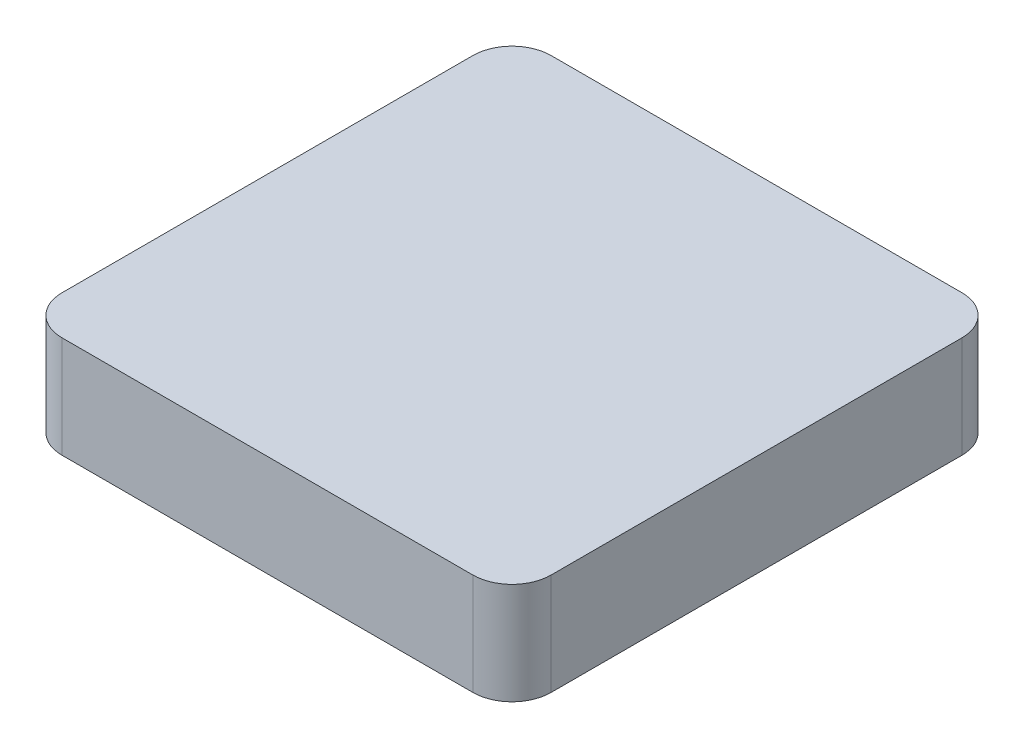
ISO-10303-21;
HEADER;
FILE_DESCRIPTION(('STEP AP214'),'2;1');
FILE_NAME('part.step','',(''),(''),'','','');
FILE_SCHEMA(('AUTOMOTIVE_DESIGN { 1 0 10303 214 1 1 1 1 }'));
ENDSEC;
DATA;
#1=APPLICATION_CONTEXT('core data for automotive mechanical design processes');
#2=APPLICATION_PROTOCOL_DEFINITION('international standard','automotive_design',2000,#1);
#3=PRODUCT_CONTEXT('',#1,'mechanical');
#4=PRODUCT('Part','Part','',(#3));
#5=PRODUCT_RELATED_PRODUCT_CATEGORY('part','',(#4));
#6=PRODUCT_DEFINITION_FORMATION('','',#4);
#7=PRODUCT_DEFINITION_CONTEXT('part definition',#1,'design');
#8=PRODUCT_DEFINITION('design','',#6,#7);
#9=PRODUCT_DEFINITION_SHAPE('','',#8);
#10=(LENGTH_UNIT() NAMED_UNIT(*) SI_UNIT(.MILLI.,.METRE.));
#11=(NAMED_UNIT(*) PLANE_ANGLE_UNIT() SI_UNIT($,.RADIAN.));
#12=(NAMED_UNIT(*) SI_UNIT($,.STERADIAN.) SOLID_ANGLE_UNIT());
#13=UNCERTAINTY_MEASURE_WITH_UNIT(LENGTH_MEASURE(1.E-05),#10,'distance_accuracy_value','');
#14=(GEOMETRIC_REPRESENTATION_CONTEXT(3) GLOBAL_UNCERTAINTY_ASSIGNED_CONTEXT((#13)) GLOBAL_UNIT_ASSIGNED_CONTEXT((#10,
#11,#12)) REPRESENTATION_CONTEXT('',''));
#15=CARTESIAN_POINT('',(0.,0.,0.));
#16=DIRECTION('',(0.,0.,1.));
#17=DIRECTION('',(1.,0.,0.));
#18=AXIS2_PLACEMENT_3D('',#15,#16,#17);
#19=CARTESIAN_POINT('',(12.5,5.2,12.5));
#20=DIRECTION('',(-1.,0.,0.));
#21=DIRECTION('',(0.,0.,1.));
#22=AXIS2_PLACEMENT_3D('',#19,#20,#21);
#23=PLANE('',#22);
#24=DIRECTION('',(0.,0.,-1.));
#25=VECTOR('',#24,1.);
#26=CARTESIAN_POINT('',(12.5,0.,12.5));
#27=LINE('',#26,#25);
#28=CARTESIAN_POINT('',(12.5,0.,10.5));
#29=VERTEX_POINT('',#28);
#30=CARTESIAN_POINT('',(12.5,0.,-10.5));
#31=VERTEX_POINT('',#30);
#32=EDGE_CURVE('E140',#29,#31,#27,.T.);
#33=ORIENTED_EDGE('',*,*,#32,.T.);
#34=DIRECTION('',(0.,-1.,0.));
#35=VECTOR('',#34,1.);
#36=CARTESIAN_POINT('',(12.5,5.2,-10.5));
#37=LINE('',#36,#35);
#38=CARTESIAN_POINT('',(12.5,5.2,-10.5));
#39=VERTEX_POINT('',#38);
#40=EDGE_CURVE('E174',#31,#39,#37,.F.);
#41=ORIENTED_EDGE('',*,*,#40,.T.);
#42=DIRECTION('',(0.,0.,-1.));
#43=VECTOR('',#42,1.);
#44=CARTESIAN_POINT('',(12.5,5.2,12.5));
#45=LINE('',#44,#43);
#46=CARTESIAN_POINT('',(12.5,5.2,10.5));
#47=VERTEX_POINT('',#46);
#48=EDGE_CURVE('E138',#47,#39,#45,.T.);
#49=ORIENTED_EDGE('',*,*,#48,.F.);
#50=DIRECTION('',(0.,-1.,0.));
#51=VECTOR('',#50,1.);
#52=CARTESIAN_POINT('',(12.5,5.2,10.5));
#53=LINE('',#52,#51);
#54=EDGE_CURVE('E170',#47,#29,#53,.T.);
#55=ORIENTED_EDGE('',*,*,#54,.T.);
#56=EDGE_LOOP('',(#33,#41,#49,#55));
#57=FACE_BOUND('',#56,.T.);
#58=ADVANCED_FACE('F39',(#57),#23,.F.);
#59=CARTESIAN_POINT('',(-12.5,5.2,-12.5));
#60=DIRECTION('',(0.,0.,1.));
#61=DIRECTION('',(1.,0.,0.));
#62=AXIS2_PLACEMENT_3D('',#59,#60,#61);
#63=PLANE('',#62);
#64=DIRECTION('',(-1.,0.,0.));
#65=VECTOR('',#64,1.);
#66=CARTESIAN_POINT('',(-12.5,0.,-12.5));
#67=LINE('',#66,#65);
#68=CARTESIAN_POINT('',(10.5,0.,-12.5));
#69=VERTEX_POINT('',#68);
#70=CARTESIAN_POINT('',(-10.5,0.,-12.5));
#71=VERTEX_POINT('',#70);
#72=EDGE_CURVE('E134',#69,#71,#67,.T.);
#73=ORIENTED_EDGE('',*,*,#72,.T.);
#74=DIRECTION('',(0.,-1.,0.));
#75=VECTOR('',#74,1.);
#76=CARTESIAN_POINT('',(-10.5,5.2,-12.5));
#77=LINE('',#76,#75);
#78=CARTESIAN_POINT('',(-10.5,5.2,-12.5));
#79=VERTEX_POINT('',#78);
#80=EDGE_CURVE('E110',#71,#79,#77,.F.);
#81=ORIENTED_EDGE('',*,*,#80,.T.);
#82=DIRECTION('',(-1.,0.,0.));
#83=VECTOR('',#82,1.);
#84=CARTESIAN_POINT('',(-12.5,5.2,-12.5));
#85=LINE('',#84,#83);
#86=CARTESIAN_POINT('',(10.5,5.2,-12.5));
#87=VERTEX_POINT('',#86);
#88=EDGE_CURVE('E193',#87,#79,#85,.T.);
#89=ORIENTED_EDGE('',*,*,#88,.F.);
#90=DIRECTION('',(0.,-1.,0.));
#91=VECTOR('',#90,1.);
#92=CARTESIAN_POINT('',(10.5,5.2,-12.5));
#93=LINE('',#92,#91);
#94=EDGE_CURVE('E116',#87,#69,#93,.T.);
#95=ORIENTED_EDGE('',*,*,#94,.T.);
#96=EDGE_LOOP('',(#73,#81,#89,#95));
#97=FACE_BOUND('',#96,.T.);
#98=ADVANCED_FACE('F214',(#97),#63,.F.);
#99=CARTESIAN_POINT('',(-12.5,5.2,12.5));
#100=DIRECTION('',(1.,0.,0.));
#101=DIRECTION('',(0.,0.,-1.));
#102=AXIS2_PLACEMENT_3D('',#99,#100,#101);
#103=PLANE('',#102);
#104=DIRECTION('',(0.,0.,1.));
#105=VECTOR('',#104,1.);
#106=CARTESIAN_POINT('',(-12.5,5.2,12.5));
#107=LINE('',#106,#105);
#108=CARTESIAN_POINT('',(-12.5,5.2,-10.5));
#109=VERTEX_POINT('',#108);
#110=CARTESIAN_POINT('',(-12.5,5.2,10.5));
#111=VERTEX_POINT('',#110);
#112=EDGE_CURVE('E125',#109,#111,#107,.T.);
#113=ORIENTED_EDGE('',*,*,#112,.F.);
#114=DIRECTION('',(0.,-1.,0.));
#115=VECTOR('',#114,1.);
#116=CARTESIAN_POINT('',(-12.5,5.2,-10.5));
#117=LINE('',#116,#115);
#118=CARTESIAN_POINT('',(-12.5,0.,-10.5));
#119=VERTEX_POINT('',#118);
#120=EDGE_CURVE('E109',#109,#119,#117,.T.);
#121=ORIENTED_EDGE('',*,*,#120,.T.);
#122=DIRECTION('',(0.,0.,1.));
#123=VECTOR('',#122,1.);
#124=CARTESIAN_POINT('',(-12.5,0.,12.5));
#125=LINE('',#124,#123);
#126=CARTESIAN_POINT('',(-12.5,0.,10.5));
#127=VERTEX_POINT('',#126);
#128=EDGE_CURVE('E123',#119,#127,#125,.T.);
#129=ORIENTED_EDGE('',*,*,#128,.T.);
#130=DIRECTION('',(0.,-1.,0.));
#131=VECTOR('',#130,1.);
#132=CARTESIAN_POINT('',(-12.5,5.2,10.5));
#133=LINE('',#132,#131);
#134=EDGE_CURVE('E128',#127,#111,#133,.F.);
#135=ORIENTED_EDGE('',*,*,#134,.T.);
#136=EDGE_LOOP('',(#113,#121,#129,#135));
#137=FACE_BOUND('',#136,.T.);
#138=ADVANCED_FACE('F122',(#137),#103,.F.);
#139=CARTESIAN_POINT('',(-12.5,5.2,12.5));
#140=DIRECTION('',(0.,0.,-1.));
#141=DIRECTION('',(-1.,0.,0.));
#142=AXIS2_PLACEMENT_3D('',#139,#140,#141);
#143=PLANE('',#142);
#144=DIRECTION('',(1.,0.,0.));
#145=VECTOR('',#144,1.);
#146=CARTESIAN_POINT('',(-12.5,0.,12.5));
#147=LINE('',#146,#145);
#148=CARTESIAN_POINT('',(-10.5,0.,12.5));
#149=VERTEX_POINT('',#148);
#150=CARTESIAN_POINT('',(10.5,0.,12.5));
#151=VERTEX_POINT('',#150);
#152=EDGE_CURVE('E133',#149,#151,#147,.T.);
#153=ORIENTED_EDGE('',*,*,#152,.T.);
#154=DIRECTION('',(0.,-1.,0.));
#155=VECTOR('',#154,1.);
#156=CARTESIAN_POINT('',(10.5,5.2,12.5));
#157=LINE('',#156,#155);
#158=CARTESIAN_POINT('',(10.5,5.2,12.5));
#159=VERTEX_POINT('',#158);
#160=EDGE_CURVE('E11',#151,#159,#157,.F.);
#161=ORIENTED_EDGE('',*,*,#160,.T.);
#162=DIRECTION('',(1.,0.,0.));
#163=VECTOR('',#162,1.);
#164=CARTESIAN_POINT('',(-12.5,5.2,12.5));
#165=LINE('',#164,#163);
#166=CARTESIAN_POINT('',(-10.5,5.2,12.5));
#167=VERTEX_POINT('',#166);
#168=EDGE_CURVE('E145',#167,#159,#165,.T.);
#169=ORIENTED_EDGE('',*,*,#168,.F.);
#170=DIRECTION('',(0.,-1.,0.));
#171=VECTOR('',#170,1.);
#172=CARTESIAN_POINT('',(-10.5,5.2,12.5));
#173=LINE('',#172,#171);
#174=EDGE_CURVE('E48',#167,#149,#173,.T.);
#175=ORIENTED_EDGE('',*,*,#174,.T.);
#176=EDGE_LOOP('',(#153,#161,#169,#175));
#177=FACE_BOUND('',#176,.T.);
#178=ADVANCED_FACE('F179',(#177),#143,.F.);
#179=CARTESIAN_POINT('',(0.,5.2,0.));
#180=DIRECTION('',(0.,-1.,0.));
#181=DIRECTION('',(0.,0.,-1.));
#182=AXIS2_PLACEMENT_3D('',#179,#180,#181);
#183=PLANE('',#182);
#184=ORIENTED_EDGE('',*,*,#88,.T.);
#185=CARTESIAN_POINT('',(-10.5,5.2,-10.5));
#186=DIRECTION('',(0.,-1.,0.));
#187=DIRECTION('',(0.,0.,-1.));
#188=AXIS2_PLACEMENT_3D('',#185,#186,#187);
#189=CIRCLE('',#188,2.);
#190=EDGE_CURVE('E167',#79,#109,#189,.F.);
#191=ORIENTED_EDGE('',*,*,#190,.T.);
#192=ORIENTED_EDGE('',*,*,#112,.T.);
#193=CARTESIAN_POINT('',(-10.5,5.2,10.5));
#194=DIRECTION('',(0.,-1.,0.));
#195=DIRECTION('',(0.,0.,-1.));
#196=AXIS2_PLACEMENT_3D('',#193,#194,#195);
#197=CIRCLE('',#196,2.);
#198=EDGE_CURVE('E60',#111,#167,#197,.F.);
#199=ORIENTED_EDGE('',*,*,#198,.T.);
#200=ORIENTED_EDGE('',*,*,#168,.T.);
#201=CARTESIAN_POINT('',(10.5,5.2,10.5));
#202=DIRECTION('',(0.,-1.,0.));
#203=DIRECTION('',(0.,0.,-1.));
#204=AXIS2_PLACEMENT_3D('',#201,#202,#203);
#205=CIRCLE('',#204,2.);
#206=EDGE_CURVE('E161',#159,#47,#205,.F.);
#207=ORIENTED_EDGE('',*,*,#206,.T.);
#208=ORIENTED_EDGE('',*,*,#48,.T.);
#209=CARTESIAN_POINT('',(10.5,5.2,-10.5));
#210=DIRECTION('',(0.,-1.,0.));
#211=DIRECTION('',(0.,0.,-1.));
#212=AXIS2_PLACEMENT_3D('',#209,#210,#211);
#213=CIRCLE('',#212,2.);
#214=EDGE_CURVE('E164',#39,#87,#213,.F.);
#215=ORIENTED_EDGE('',*,*,#214,.T.);
#216=EDGE_LOOP('',(#184,#191,#192,#199,#200,#207,#208,#215));
#217=FACE_BOUND('',#216,.T.);
#218=ADVANCED_FACE('F203',(#217),#183,.F.);
#219=CARTESIAN_POINT('',(0.,0.,0.));
#220=DIRECTION('',(0.,-1.,0.));
#221=DIRECTION('',(0.,0.,-1.));
#222=AXIS2_PLACEMENT_3D('',#219,#220,#221);
#223=PLANE('',#222);
#224=ORIENTED_EDGE('',*,*,#128,.F.);
#225=CARTESIAN_POINT('',(-10.5,0.,-10.5));
#226=DIRECTION('',(0.,-1.,0.));
#227=DIRECTION('',(0.,0.,-1.));
#228=AXIS2_PLACEMENT_3D('',#225,#226,#227);
#229=CIRCLE('',#228,2.);
#230=EDGE_CURVE('E105',#119,#71,#229,.T.);
#231=ORIENTED_EDGE('',*,*,#230,.T.);
#232=ORIENTED_EDGE('',*,*,#72,.F.);
#233=CARTESIAN_POINT('',(10.5,0.,-10.5));
#234=DIRECTION('',(0.,-1.,0.));
#235=DIRECTION('',(0.,0.,-1.));
#236=AXIS2_PLACEMENT_3D('',#233,#234,#235);
#237=CIRCLE('',#236,2.);
#238=EDGE_CURVE('E117',#69,#31,#237,.T.);
#239=ORIENTED_EDGE('',*,*,#238,.T.);
#240=ORIENTED_EDGE('',*,*,#32,.F.);
#241=CARTESIAN_POINT('',(10.5,0.,10.5));
#242=DIRECTION('',(0.,-1.,0.));
#243=DIRECTION('',(0.,0.,-1.));
#244=AXIS2_PLACEMENT_3D('',#241,#242,#243);
#245=CIRCLE('',#244,2.);
#246=EDGE_CURVE('E149',#29,#151,#245,.T.);
#247=ORIENTED_EDGE('',*,*,#246,.T.);
#248=ORIENTED_EDGE('',*,*,#152,.F.);
#249=CARTESIAN_POINT('',(-10.5,0.,10.5));
#250=DIRECTION('',(0.,-1.,0.));
#251=DIRECTION('',(0.,0.,-1.));
#252=AXIS2_PLACEMENT_3D('',#249,#250,#251);
#253=CIRCLE('',#252,2.);
#254=EDGE_CURVE('E127',#149,#127,#253,.T.);
#255=ORIENTED_EDGE('',*,*,#254,.T.);
#256=EDGE_LOOP('',(#224,#231,#232,#239,#240,#247,#248,#255));
#257=FACE_BOUND('',#256,.T.);
#258=ADVANCED_FACE('F130',(#257),#223,.T.);
#259=CARTESIAN_POINT('',(-10.5,5.2,-10.5));
#260=DIRECTION('',(0.,-1.,0.));
#261=DIRECTION('',(0.,0.,-1.));
#262=AXIS2_PLACEMENT_3D('',#259,#260,#261);
#263=CYLINDRICAL_SURFACE('',#262,2.);
#264=ORIENTED_EDGE('',*,*,#190,.F.);
#265=ORIENTED_EDGE('',*,*,#80,.F.);
#266=ORIENTED_EDGE('',*,*,#230,.F.);
#267=ORIENTED_EDGE('',*,*,#120,.F.);
#268=EDGE_LOOP('',(#264,#265,#266,#267));
#269=FACE_BOUND('',#268,.T.);
#270=ADVANCED_FACE('F108',(#269),#263,.T.);
#271=CARTESIAN_POINT('',(10.5,5.2,-10.5));
#272=DIRECTION('',(0.,-1.,0.));
#273=DIRECTION('',(0.,0.,-1.));
#274=AXIS2_PLACEMENT_3D('',#271,#272,#273);
#275=CYLINDRICAL_SURFACE('',#274,2.);
#276=ORIENTED_EDGE('',*,*,#214,.F.);
#277=ORIENTED_EDGE('',*,*,#40,.F.);
#278=ORIENTED_EDGE('',*,*,#238,.F.);
#279=ORIENTED_EDGE('',*,*,#94,.F.);
#280=EDGE_LOOP('',(#276,#277,#278,#279));
#281=FACE_BOUND('',#280,.T.);
#282=ADVANCED_FACE('F225',(#281),#275,.T.);
#283=CARTESIAN_POINT('',(10.5,5.2,10.5));
#284=DIRECTION('',(0.,-1.,0.));
#285=DIRECTION('',(0.,0.,-1.));
#286=AXIS2_PLACEMENT_3D('',#283,#284,#285);
#287=CYLINDRICAL_SURFACE('',#286,2.);
#288=ORIENTED_EDGE('',*,*,#206,.F.);
#289=ORIENTED_EDGE('',*,*,#160,.F.);
#290=ORIENTED_EDGE('',*,*,#246,.F.);
#291=ORIENTED_EDGE('',*,*,#54,.F.);
#292=EDGE_LOOP('',(#288,#289,#290,#291));
#293=FACE_BOUND('',#292,.T.);
#294=ADVANCED_FACE('F186',(#293),#287,.T.);
#295=CARTESIAN_POINT('',(-10.5,5.2,10.5));
#296=DIRECTION('',(0.,-1.,0.));
#297=DIRECTION('',(0.,0.,-1.));
#298=AXIS2_PLACEMENT_3D('',#295,#296,#297);
#299=CYLINDRICAL_SURFACE('',#298,2.);
#300=ORIENTED_EDGE('',*,*,#198,.F.);
#301=ORIENTED_EDGE('',*,*,#134,.F.);
#302=ORIENTED_EDGE('',*,*,#254,.F.);
#303=ORIENTED_EDGE('',*,*,#174,.F.);
#304=EDGE_LOOP('',(#300,#301,#302,#303));
#305=FACE_BOUND('',#304,.T.);
#306=ADVANCED_FACE('F41',(#305),#299,.T.);
#307=CLOSED_SHELL('',(#58,#98,#138,#178,#218,#258,#270,#282,#294,#306));
#308=MANIFOLD_SOLID_BREP('B2',#307);
#309=ADVANCED_BREP_SHAPE_REPRESENTATION('',(#18,#308),#14);
#310=SHAPE_DEFINITION_REPRESENTATION(#9,#309);
ENDSEC;
END-ISO-10303-21;
